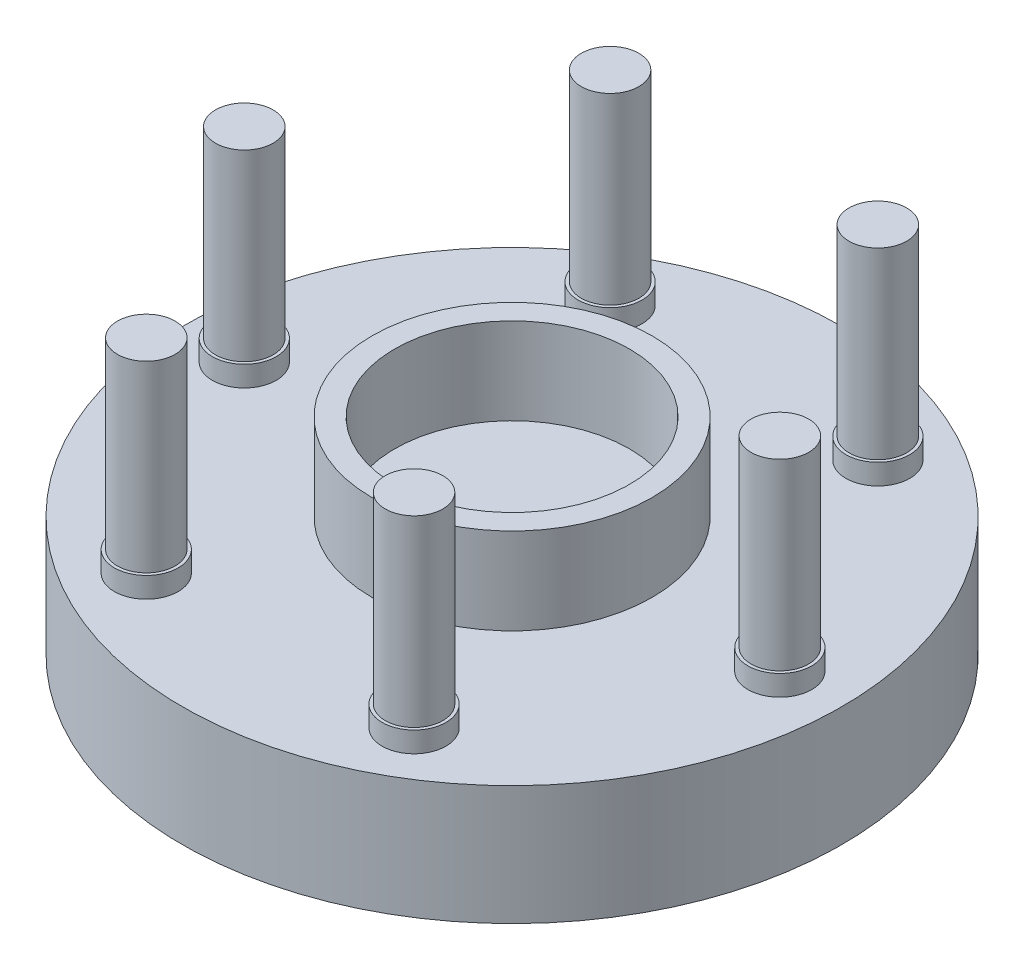
ISO-10303-21;
HEADER;
FILE_DESCRIPTION(('STEP AP214'),'2;1');
FILE_NAME('part.step','',(''),(''),'','','');
FILE_SCHEMA(('AUTOMOTIVE_DESIGN { 1 0 10303 214 1 1 1 1 }'));
ENDSEC;
DATA;
#1=APPLICATION_CONTEXT('core data for automotive mechanical design processes');
#2=APPLICATION_PROTOCOL_DEFINITION('international standard','automotive_design',2000,#1);
#3=PRODUCT_CONTEXT('',#1,'mechanical');
#4=PRODUCT('Part','Part','',(#3));
#5=PRODUCT_RELATED_PRODUCT_CATEGORY('part','',(#4));
#6=PRODUCT_DEFINITION_FORMATION('','',#4);
#7=PRODUCT_DEFINITION_CONTEXT('part definition',#1,'design');
#8=PRODUCT_DEFINITION('design','',#6,#7);
#9=PRODUCT_DEFINITION_SHAPE('','',#8);
#10=(LENGTH_UNIT() NAMED_UNIT(*) SI_UNIT(.MILLI.,.METRE.));
#11=(NAMED_UNIT(*) PLANE_ANGLE_UNIT() SI_UNIT($,.RADIAN.));
#12=(NAMED_UNIT(*) SI_UNIT($,.STERADIAN.) SOLID_ANGLE_UNIT());
#13=UNCERTAINTY_MEASURE_WITH_UNIT(LENGTH_MEASURE(1.E-05),#10,'distance_accuracy_value','');
#14=(GEOMETRIC_REPRESENTATION_CONTEXT(3) GLOBAL_UNCERTAINTY_ASSIGNED_CONTEXT((#13)) GLOBAL_UNIT_ASSIGNED_CONTEXT((#10,
#11,#12)) REPRESENTATION_CONTEXT('',''));
#15=CARTESIAN_POINT('',(0.,0.,0.));
#16=DIRECTION('',(0.,0.,1.));
#17=DIRECTION('',(1.,0.,0.));
#18=AXIS2_PLACEMENT_3D('',#15,#16,#17);
#19=CARTESIAN_POINT('',(0.,29.,0.));
#20=DIRECTION('',(0.,-1.,0.));
#21=DIRECTION('',(0.,0.,-1.));
#22=AXIS2_PLACEMENT_3D('',#19,#20,#21);
#23=CYLINDRICAL_SURFACE('',#22,80.);
#24=CARTESIAN_POINT('',(0.,29.,0.));
#25=DIRECTION('',(0.,1.,0.));
#26=DIRECTION('',(0.,0.,1.));
#27=AXIS2_PLACEMENT_3D('',#24,#25,#26);
#28=CIRCLE('',#27,80.);
#29=CARTESIAN_POINT('',(0.,29.,-80.));
#30=VERTEX_POINT('',#29);
#31=EDGE_CURVE('E149',#30,#30,#28,.T.);
#32=CARTESIAN_POINT('',(0.,0.,0.));
#33=DIRECTION('',(0.,1.,0.));
#34=DIRECTION('',(0.,0.,1.));
#35=AXIS2_PLACEMENT_3D('',#32,#33,#34);
#36=CIRCLE('',#35,80.);
#37=CARTESIAN_POINT('',(0.,0.,-80.));
#38=VERTEX_POINT('',#37);
#39=EDGE_CURVE('E145',#38,#38,#36,.T.);
#40=CARTESIAN_POINT('',(0.,29.,-80.));
#41=CARTESIAN_POINT('',(0.,28.6979166666667,-80.));
#42=CARTESIAN_POINT('',(0.,28.3958333333333,-80.));
#43=CARTESIAN_POINT('',(0.,27.7916666666667,-80.));
#44=CARTESIAN_POINT('',(0.,27.4895833333333,-80.));
#45=CARTESIAN_POINT('',(0.,26.8854166666667,-80.));
#46=CARTESIAN_POINT('',(0.,26.5833333333333,-80.));
#47=CARTESIAN_POINT('',(0.,25.9791666666667,-80.));
#48=CARTESIAN_POINT('',(0.,25.6770833333333,-80.));
#49=CARTESIAN_POINT('',(0.,25.0729166666667,-80.));
#50=CARTESIAN_POINT('',(0.,24.7708333333333,-80.));
#51=CARTESIAN_POINT('',(0.,24.1666666666667,-80.));
#52=CARTESIAN_POINT('',(0.,23.8645833333333,-80.));
#53=CARTESIAN_POINT('',(0.,23.2604166666667,-80.));
#54=CARTESIAN_POINT('',(0.,22.9583333333333,-80.));
#55=CARTESIAN_POINT('',(0.,22.3541666666667,-80.));
#56=CARTESIAN_POINT('',(0.,22.0520833333333,-80.));
#57=CARTESIAN_POINT('',(0.,21.4479166666667,-80.));
#58=CARTESIAN_POINT('',(0.,21.1458333333333,-80.));
#59=CARTESIAN_POINT('',(0.,20.5416666666667,-80.));
#60=CARTESIAN_POINT('',(0.,20.2395833333333,-80.));
#61=CARTESIAN_POINT('',(0.,19.6354166666667,-80.));
#62=CARTESIAN_POINT('',(0.,19.3333333333333,-80.));
#63=CARTESIAN_POINT('',(0.,18.7291666666667,-80.));
#64=CARTESIAN_POINT('',(0.,18.4270833333333,-80.));
#65=CARTESIAN_POINT('',(0.,17.8229166666667,-80.));
#66=CARTESIAN_POINT('',(0.,17.5208333333333,-80.));
#67=CARTESIAN_POINT('',(0.,16.9166666666667,-80.));
#68=CARTESIAN_POINT('',(0.,16.6145833333333,-80.));
#69=CARTESIAN_POINT('',(0.,16.0104166666667,-80.));
#70=CARTESIAN_POINT('',(0.,15.7083333333333,-80.));
#71=CARTESIAN_POINT('',(0.,15.1041666666667,-80.));
#72=CARTESIAN_POINT('',(0.,14.8020833333333,-80.));
#73=CARTESIAN_POINT('',(0.,14.1979166666667,-80.));
#74=CARTESIAN_POINT('',(0.,13.8958333333333,-80.));
#75=CARTESIAN_POINT('',(0.,13.2916666666667,-80.));
#76=CARTESIAN_POINT('',(0.,12.9895833333333,-80.));
#77=CARTESIAN_POINT('',(0.,12.3854166666667,-80.));
#78=CARTESIAN_POINT('',(0.,12.0833333333333,-80.));
#79=CARTESIAN_POINT('',(0.,11.4791666666667,-80.));
#80=CARTESIAN_POINT('',(0.,11.1770833333333,-80.));
#81=CARTESIAN_POINT('',(0.,10.5729166666667,-80.));
#82=CARTESIAN_POINT('',(0.,10.2708333333333,-80.));
#83=CARTESIAN_POINT('',(0.,9.66666666666667,-80.));
#84=CARTESIAN_POINT('',(0.,9.36458333333333,-80.));
#85=CARTESIAN_POINT('',(0.,8.76041666666667,-80.));
#86=CARTESIAN_POINT('',(0.,8.45833333333333,-80.));
#87=CARTESIAN_POINT('',(0.,7.85416666666667,-80.));
#88=CARTESIAN_POINT('',(0.,7.55208333333333,-80.));
#89=CARTESIAN_POINT('',(0.,6.94791666666667,-80.));
#90=CARTESIAN_POINT('',(0.,6.64583333333333,-80.));
#91=CARTESIAN_POINT('',(0.,6.04166666666667,-80.));
#92=CARTESIAN_POINT('',(0.,5.73958333333333,-80.));
#93=CARTESIAN_POINT('',(0.,5.13541666666667,-80.));
#94=CARTESIAN_POINT('',(0.,4.83333333333333,-80.));
#95=CARTESIAN_POINT('',(0.,4.22916666666667,-80.));
#96=CARTESIAN_POINT('',(0.,3.92708333333333,-80.));
#97=CARTESIAN_POINT('',(0.,3.32291666666667,-80.));
#98=CARTESIAN_POINT('',(0.,3.02083333333333,-80.));
#99=CARTESIAN_POINT('',(0.,2.41666666666667,-80.));
#100=CARTESIAN_POINT('',(0.,2.11458333333333,-80.));
#101=CARTESIAN_POINT('',(0.,1.51041666666667,-80.));
#102=CARTESIAN_POINT('',(0.,1.20833333333333,-80.));
#103=CARTESIAN_POINT('',(0.,0.604166666666667,-80.));
#104=CARTESIAN_POINT('',(0.,0.302083333333333,-80.));
#105=CARTESIAN_POINT('',(0.,0.,-80.));
#106=B_SPLINE_CURVE_WITH_KNOTS('',3,(#40,#41,#42,#43,#44,#45,#46,#47,#48,#49,#50,#51,#52,#53,
#54,#55,#56,#57,#58,#59,#60,#61,#62,#63,#64,#65,#66,#67,#68,#69,#70,#71,#72,#73,#74,#75,#76,#77,
#78,#79,#80,#81,#82,#83,#84,#85,#86,#87,#88,#89,#90,#91,#92,#93,#94,#95,#96,#97,#98,#99,#100,
#101,#102,#103,#104,#105),.UNSPECIFIED.,.F.,.F.,(4,2,2,2,2,2,2,2,2,2,2,2,2,2,2,2,2,2,2,2,2,2,2,
2,2,2,2,2,2,2,2,2,4),(0.,0.906249999999997,1.8125,2.71875,3.625,4.53125,5.4375,6.34375,7.25,
8.15625,9.0625,9.96875,10.875,11.78125,12.6875,13.59375,14.5,15.40625,16.3125,17.21875,18.125,
19.03125,19.9375,20.84375,21.75,22.65625,23.5625,24.46875,25.375,26.28125,27.1875,28.09375,29.),.UNSPECIFIED.);
#107=EDGE_CURVE('BSEAM43',#30,#38,#106,.T.);
#108=ORIENTED_EDGE('',*,*,#31,.F.);
#109=ORIENTED_EDGE('',*,*,#39,.T.);
#110=ORIENTED_EDGE('',*,*,#107,.T.);
#111=ORIENTED_EDGE('',*,*,#107,.F.);
#112=EDGE_LOOP('',(#108,#110,#109,#111));
#113=FACE_BOUND('',#112,.T.);
#114=ADVANCED_FACE('F43',(#113),#23,.T.);
#115=CARTESIAN_POINT('',(0.,29.,0.));
#116=DIRECTION('',(0.,1.,0.));
#117=DIRECTION('',(0.,0.,1.));
#118=AXIS2_PLACEMENT_3D('',#115,#116,#117);
#119=PLANE('',#118);
#120=CARTESIAN_POINT('',(65.,29.,0.));
#121=DIRECTION('',(0.,1.,0.));
#122=DIRECTION('',(0.,0.,1.));
#123=AXIS2_PLACEMENT_3D('',#120,#121,#122);
#124=CIRCLE('',#123,7.75);
#125=CARTESIAN_POINT('',(65.,29.,7.75));
#126=VERTEX_POINT('',#125);
#127=EDGE_CURVE('E93',#126,#126,#124,.T.);
#128=ORIENTED_EDGE('',*,*,#127,.F.);
#129=EDGE_LOOP('',(#128));
#130=FACE_BOUND('',#129,.T.);
#131=CARTESIAN_POINT('',(32.5000000000007,29.,-56.2916512459881));
#132=DIRECTION('',(0.,1.,0.));
#133=DIRECTION('',(0.,0.,1.));
#134=AXIS2_PLACEMENT_3D('',#131,#132,#133);
#135=CIRCLE('',#134,7.74999999999999);
#136=CARTESIAN_POINT('',(32.5000000000007,29.,-48.5416512459882));
#137=VERTEX_POINT('',#136);
#138=EDGE_CURVE('E98',#137,#137,#135,.T.);
#139=ORIENTED_EDGE('',*,*,#138,.F.);
#140=EDGE_LOOP('',(#139));
#141=FACE_BOUND('',#140,.T.);
#142=CARTESIAN_POINT('',(-32.4999999999995,29.,-56.2916512459888));
#143=DIRECTION('',(0.,1.,0.));
#144=DIRECTION('',(0.,0.,1.));
#145=AXIS2_PLACEMENT_3D('',#142,#143,#144);
#146=CIRCLE('',#145,7.75);
#147=CARTESIAN_POINT('',(-32.4999999999995,29.,-48.5416512459888));
#148=VERTEX_POINT('',#147);
#149=EDGE_CURVE('E130',#148,#148,#146,.T.);
#150=ORIENTED_EDGE('',*,*,#149,.F.);
#151=EDGE_LOOP('',(#150));
#152=FACE_BOUND('',#151,.T.);
#153=CARTESIAN_POINT('',(-65.,29.,-4.53892574049607E-13));
#154=DIRECTION('',(0.,1.,0.));
#155=DIRECTION('',(0.,0.,1.));
#156=AXIS2_PLACEMENT_3D('',#153,#154,#155);
#157=CIRCLE('',#156,7.75);
#158=CARTESIAN_POINT('',(-65.,29.,7.74999999999954));
#159=VERTEX_POINT('',#158);
#160=EDGE_CURVE('E122',#159,#159,#157,.T.);
#161=ORIENTED_EDGE('',*,*,#160,.F.);
#162=EDGE_LOOP('',(#161));
#163=FACE_BOUND('',#162,.T.);
#164=CARTESIAN_POINT('',(-32.5000000000003,29.,56.2916512459884));
#165=DIRECTION('',(0.,1.,0.));
#166=DIRECTION('',(0.,0.,1.));
#167=AXIS2_PLACEMENT_3D('',#164,#165,#166);
#168=CIRCLE('',#167,7.75);
#169=CARTESIAN_POINT('',(-32.5000000000003,29.,64.0416512459884));
#170=VERTEX_POINT('',#169);
#171=EDGE_CURVE('E114',#170,#170,#168,.T.);
#172=ORIENTED_EDGE('',*,*,#171,.F.);
#173=EDGE_LOOP('',(#172));
#174=FACE_BOUND('',#173,.T.);
#175=CARTESIAN_POINT('',(32.4999999999999,29.,56.2916512459886));
#176=DIRECTION('',(0.,1.,0.));
#177=DIRECTION('',(0.,0.,1.));
#178=AXIS2_PLACEMENT_3D('',#175,#176,#177);
#179=CIRCLE('',#178,7.75);
#180=CARTESIAN_POINT('',(32.4999999999999,29.,64.0416512459886));
#181=VERTEX_POINT('',#180);
#182=EDGE_CURVE('E97',#181,#181,#179,.T.);
#183=ORIENTED_EDGE('',*,*,#182,.F.);
#184=EDGE_LOOP('',(#183));
#185=FACE_BOUND('',#184,.T.);
#186=CARTESIAN_POINT('',(0.,29.,0.));
#187=DIRECTION('',(0.,1.,0.));
#188=DIRECTION('',(0.,0.,1.));
#189=AXIS2_PLACEMENT_3D('',#186,#187,#188);
#190=CIRCLE('',#189,34.);
#191=CARTESIAN_POINT('',(0.,29.,-34.));
#192=VERTEX_POINT('',#191);
#193=EDGE_CURVE('E140',#192,#192,#190,.T.);
#194=ORIENTED_EDGE('',*,*,#193,.F.);
#195=EDGE_LOOP('',(#194));
#196=FACE_BOUND('',#195,.T.);
#197=ORIENTED_EDGE('',*,*,#31,.T.);
#198=EDGE_LOOP('',(#197));
#199=FACE_BOUND('',#198,.T.);
#200=ADVANCED_FACE('F160',(#130,#141,#152,#163,#174,#185,#196,#199),#119,.T.);
#201=CARTESIAN_POINT('',(0.,0.,0.));
#202=DIRECTION('',(0.,1.,0.));
#203=DIRECTION('',(0.,0.,1.));
#204=AXIS2_PLACEMENT_3D('',#201,#202,#203);
#205=PLANE('',#204);
#206=ORIENTED_EDGE('',*,*,#39,.F.);
#207=EDGE_LOOP('',(#206));
#208=FACE_BOUND('',#207,.T.);
#209=ADVANCED_FACE('F157',(#208),#205,.F.);
#210=CARTESIAN_POINT('',(0.,50.,0.));
#211=DIRECTION('',(0.,1.,0.));
#212=DIRECTION('',(0.,0.,1.));
#213=AXIS2_PLACEMENT_3D('',#210,#211,#212);
#214=PLANE('',#213);
#215=CARTESIAN_POINT('',(0.,50.,0.));
#216=DIRECTION('',(0.,1.,0.));
#217=DIRECTION('',(0.,0.,1.));
#218=AXIS2_PLACEMENT_3D('',#215,#216,#217);
#219=CIRCLE('',#218,34.);
#220=CARTESIAN_POINT('',(0.,50.,-34.));
#221=VERTEX_POINT('',#220);
#222=EDGE_CURVE('E141',#221,#221,#219,.T.);
#223=ORIENTED_EDGE('',*,*,#222,.T.);
#224=EDGE_LOOP('',(#223));
#225=FACE_BOUND('',#224,.T.);
#226=CARTESIAN_POINT('',(0.,50.,0.));
#227=DIRECTION('',(0.,1.,0.));
#228=DIRECTION('',(0.,0.,1.));
#229=AXIS2_PLACEMENT_3D('',#226,#227,#228);
#230=CIRCLE('',#229,28.5);
#231=CARTESIAN_POINT('',(0.,50.,-28.5));
#232=VERTEX_POINT('',#231);
#233=EDGE_CURVE('E92',#232,#232,#230,.T.);
#234=ORIENTED_EDGE('',*,*,#233,.F.);
#235=EDGE_LOOP('',(#234));
#236=FACE_BOUND('',#235,.T.);
#237=ADVANCED_FACE('F159',(#225,#236),#214,.T.);
#238=CARTESIAN_POINT('',(0.,50.,0.));
#239=DIRECTION('',(0.,-1.,0.));
#240=DIRECTION('',(0.,0.,-1.));
#241=AXIS2_PLACEMENT_3D('',#238,#239,#240);
#242=CYLINDRICAL_SURFACE('',#241,34.);
#243=CARTESIAN_POINT('',(0.,50.,-34.));
#244=CARTESIAN_POINT('',(0.,49.78125,-34.));
#245=CARTESIAN_POINT('',(0.,49.5625,-34.));
#246=CARTESIAN_POINT('',(0.,49.125,-34.));
#247=CARTESIAN_POINT('',(0.,48.90625,-34.));
#248=CARTESIAN_POINT('',(0.,48.46875,-34.));
#249=CARTESIAN_POINT('',(0.,48.25,-34.));
#250=CARTESIAN_POINT('',(0.,47.8125,-34.));
#251=CARTESIAN_POINT('',(0.,47.59375,-34.));
#252=CARTESIAN_POINT('',(0.,47.15625,-34.));
#253=CARTESIAN_POINT('',(0.,46.9375,-34.));
#254=CARTESIAN_POINT('',(0.,46.5,-34.));
#255=CARTESIAN_POINT('',(0.,46.28125,-34.));
#256=CARTESIAN_POINT('',(0.,45.84375,-34.));
#257=CARTESIAN_POINT('',(0.,45.625,-34.));
#258=CARTESIAN_POINT('',(0.,45.1875,-34.));
#259=CARTESIAN_POINT('',(0.,44.96875,-34.));
#260=CARTESIAN_POINT('',(0.,44.53125,-34.));
#261=CARTESIAN_POINT('',(0.,44.3125,-34.));
#262=CARTESIAN_POINT('',(0.,43.875,-34.));
#263=CARTESIAN_POINT('',(0.,43.65625,-34.));
#264=CARTESIAN_POINT('',(0.,43.21875,-34.));
#265=CARTESIAN_POINT('',(0.,43.,-34.));
#266=CARTESIAN_POINT('',(0.,42.5625,-34.));
#267=CARTESIAN_POINT('',(0.,42.34375,-34.));
#268=CARTESIAN_POINT('',(0.,41.90625,-34.));
#269=CARTESIAN_POINT('',(0.,41.6875,-34.));
#270=CARTESIAN_POINT('',(0.,41.25,-34.));
#271=CARTESIAN_POINT('',(0.,41.03125,-34.));
#272=CARTESIAN_POINT('',(0.,40.59375,-34.));
#273=CARTESIAN_POINT('',(0.,40.375,-34.));
#274=CARTESIAN_POINT('',(0.,39.9375,-34.));
#275=CARTESIAN_POINT('',(0.,39.71875,-34.));
#276=CARTESIAN_POINT('',(0.,39.28125,-34.));
#277=CARTESIAN_POINT('',(0.,39.0625,-34.));
#278=CARTESIAN_POINT('',(0.,38.625,-34.));
#279=CARTESIAN_POINT('',(0.,38.40625,-34.));
#280=CARTESIAN_POINT('',(0.,37.96875,-34.));
#281=CARTESIAN_POINT('',(0.,37.75,-34.));
#282=CARTESIAN_POINT('',(0.,37.3125,-34.));
#283=CARTESIAN_POINT('',(0.,37.09375,-34.));
#284=CARTESIAN_POINT('',(0.,36.65625,-34.));
#285=CARTESIAN_POINT('',(0.,36.4375,-34.));
#286=CARTESIAN_POINT('',(0.,36.,-34.));
#287=CARTESIAN_POINT('',(0.,35.78125,-34.));
#288=CARTESIAN_POINT('',(0.,35.34375,-34.));
#289=CARTESIAN_POINT('',(0.,35.125,-34.));
#290=CARTESIAN_POINT('',(0.,34.6875,-34.));
#291=CARTESIAN_POINT('',(0.,34.46875,-34.));
#292=CARTESIAN_POINT('',(0.,34.03125,-34.));
#293=CARTESIAN_POINT('',(0.,33.8125,-34.));
#294=CARTESIAN_POINT('',(0.,33.375,-34.));
#295=CARTESIAN_POINT('',(0.,33.15625,-34.));
#296=CARTESIAN_POINT('',(0.,32.71875,-34.));
#297=CARTESIAN_POINT('',(0.,32.5,-34.));
#298=CARTESIAN_POINT('',(0.,32.0625,-34.));
#299=CARTESIAN_POINT('',(0.,31.84375,-34.));
#300=CARTESIAN_POINT('',(0.,31.40625,-34.));
#301=CARTESIAN_POINT('',(0.,31.1875,-34.));
#302=CARTESIAN_POINT('',(0.,30.75,-34.));
#303=CARTESIAN_POINT('',(0.,30.53125,-34.));
#304=CARTESIAN_POINT('',(0.,30.09375,-34.));
#305=CARTESIAN_POINT('',(0.,29.875,-34.));
#306=CARTESIAN_POINT('',(0.,29.4375,-34.));
#307=CARTESIAN_POINT('',(0.,29.21875,-34.));
#308=CARTESIAN_POINT('',(0.,29.,-34.));
#309=B_SPLINE_CURVE_WITH_KNOTS('',3,(#243,#244,#245,#246,#247,#248,#249,#250,#251,#252,#253,
#254,#255,#256,#257,#258,#259,#260,#261,#262,#263,#264,#265,#266,#267,#268,#269,#270,#271,#272,
#273,#274,#275,#276,#277,#278,#279,#280,#281,#282,#283,#284,#285,#286,#287,#288,#289,#290,#291,
#292,#293,#294,#295,#296,#297,#298,#299,#300,#301,#302,#303,#304,#305,#306,#307,#308),
.UNSPECIFIED.,.F.,.F.,(4,2,2,2,2,2,2,2,2,2,2,2,2,2,2,2,2,2,2,2,2,2,2,2,2,2,2,2,2,2,2,2,4),(0.,
0.656249999999997,1.31249999999999,1.96875,2.625,3.28125,3.9375,4.59374999999999,5.25,
5.90624999999999,6.5625,7.21875,7.87499999999999,8.53125,9.18749999999999,9.84374999999999,10.5,
11.15625,11.8125,12.46875,13.125,13.78125,14.4375,15.09375,15.75,16.40625,17.0625,17.71875,
18.375,19.03125,19.6875,20.34375,21.),.UNSPECIFIED.);
#310=EDGE_CURVE('BSEAM165',#221,#192,#309,.T.);
#311=ORIENTED_EDGE('',*,*,#222,.F.);
#312=ORIENTED_EDGE('',*,*,#193,.T.);
#313=ORIENTED_EDGE('',*,*,#310,.T.);
#314=ORIENTED_EDGE('',*,*,#310,.F.);
#315=EDGE_LOOP('',(#311,#313,#312,#314));
#316=FACE_BOUND('',#315,.T.);
#317=ADVANCED_FACE('F165',(#316),#242,.T.);
#318=CARTESIAN_POINT('',(0.,50.,0.));
#319=DIRECTION('',(0.,-1.,0.));
#320=DIRECTION('',(0.,0.,-1.));
#321=AXIS2_PLACEMENT_3D('',#318,#319,#320);
#322=CYLINDRICAL_SURFACE('',#321,28.5);
#323=CARTESIAN_POINT('',(0.,29.,0.));
#324=DIRECTION('',(0.,1.,0.));
#325=DIRECTION('',(0.,0.,1.));
#326=AXIS2_PLACEMENT_3D('',#323,#324,#325);
#327=CIRCLE('',#326,28.5);
#328=CARTESIAN_POINT('',(0.,29.,-28.5));
#329=VERTEX_POINT('',#328);
#330=EDGE_CURVE('E46',#329,#329,#327,.F.);
#331=CARTESIAN_POINT('',(0.,50.,-28.5));
#332=CARTESIAN_POINT('',(0.,49.78125,-28.5));
#333=CARTESIAN_POINT('',(0.,49.5625,-28.5));
#334=CARTESIAN_POINT('',(0.,49.125,-28.5));
#335=CARTESIAN_POINT('',(0.,48.90625,-28.5));
#336=CARTESIAN_POINT('',(0.,48.46875,-28.5));
#337=CARTESIAN_POINT('',(0.,48.25,-28.5));
#338=CARTESIAN_POINT('',(0.,47.8125,-28.5));
#339=CARTESIAN_POINT('',(0.,47.59375,-28.5));
#340=CARTESIAN_POINT('',(0.,47.15625,-28.5));
#341=CARTESIAN_POINT('',(0.,46.9375,-28.5));
#342=CARTESIAN_POINT('',(0.,46.5,-28.5));
#343=CARTESIAN_POINT('',(0.,46.28125,-28.5));
#344=CARTESIAN_POINT('',(0.,45.84375,-28.5));
#345=CARTESIAN_POINT('',(0.,45.625,-28.5));
#346=CARTESIAN_POINT('',(0.,45.1875,-28.5));
#347=CARTESIAN_POINT('',(0.,44.96875,-28.5));
#348=CARTESIAN_POINT('',(0.,44.53125,-28.5));
#349=CARTESIAN_POINT('',(0.,44.3125,-28.5));
#350=CARTESIAN_POINT('',(0.,43.875,-28.5));
#351=CARTESIAN_POINT('',(0.,43.65625,-28.5));
#352=CARTESIAN_POINT('',(0.,43.21875,-28.5));
#353=CARTESIAN_POINT('',(0.,43.,-28.5));
#354=CARTESIAN_POINT('',(0.,42.5625,-28.5));
#355=CARTESIAN_POINT('',(0.,42.34375,-28.5));
#356=CARTESIAN_POINT('',(0.,41.90625,-28.5));
#357=CARTESIAN_POINT('',(0.,41.6875,-28.5));
#358=CARTESIAN_POINT('',(0.,41.25,-28.5));
#359=CARTESIAN_POINT('',(0.,41.03125,-28.5));
#360=CARTESIAN_POINT('',(0.,40.59375,-28.5));
#361=CARTESIAN_POINT('',(0.,40.375,-28.5));
#362=CARTESIAN_POINT('',(0.,39.9375,-28.5));
#363=CARTESIAN_POINT('',(0.,39.71875,-28.5));
#364=CARTESIAN_POINT('',(0.,39.28125,-28.5));
#365=CARTESIAN_POINT('',(0.,39.0625,-28.5));
#366=CARTESIAN_POINT('',(0.,38.625,-28.5));
#367=CARTESIAN_POINT('',(0.,38.40625,-28.5));
#368=CARTESIAN_POINT('',(0.,37.96875,-28.5));
#369=CARTESIAN_POINT('',(0.,37.75,-28.5));
#370=CARTESIAN_POINT('',(0.,37.3125,-28.5));
#371=CARTESIAN_POINT('',(0.,37.09375,-28.5));
#372=CARTESIAN_POINT('',(0.,36.65625,-28.5));
#373=CARTESIAN_POINT('',(0.,36.4375,-28.5));
#374=CARTESIAN_POINT('',(0.,36.,-28.5));
#375=CARTESIAN_POINT('',(0.,35.78125,-28.5));
#376=CARTESIAN_POINT('',(0.,35.34375,-28.5));
#377=CARTESIAN_POINT('',(0.,35.125,-28.5));
#378=CARTESIAN_POINT('',(0.,34.6875,-28.5));
#379=CARTESIAN_POINT('',(0.,34.46875,-28.5));
#380=CARTESIAN_POINT('',(0.,34.03125,-28.5));
#381=CARTESIAN_POINT('',(0.,33.8125,-28.5));
#382=CARTESIAN_POINT('',(0.,33.375,-28.5));
#383=CARTESIAN_POINT('',(0.,33.15625,-28.5));
#384=CARTESIAN_POINT('',(0.,32.71875,-28.5));
#385=CARTESIAN_POINT('',(0.,32.5,-28.5));
#386=CARTESIAN_POINT('',(0.,32.0625,-28.5));
#387=CARTESIAN_POINT('',(0.,31.84375,-28.5));
#388=CARTESIAN_POINT('',(0.,31.40625,-28.5));
#389=CARTESIAN_POINT('',(0.,31.1875,-28.5));
#390=CARTESIAN_POINT('',(0.,30.75,-28.5));
#391=CARTESIAN_POINT('',(0.,30.53125,-28.5));
#392=CARTESIAN_POINT('',(0.,30.09375,-28.5));
#393=CARTESIAN_POINT('',(0.,29.875,-28.5));
#394=CARTESIAN_POINT('',(0.,29.4375,-28.5));
#395=CARTESIAN_POINT('',(0.,29.21875,-28.5));
#396=CARTESIAN_POINT('',(0.,29.,-28.5));
#397=B_SPLINE_CURVE_WITH_KNOTS('',3,(#331,#332,#333,#334,#335,#336,#337,#338,#339,#340,#341,
#342,#343,#344,#345,#346,#347,#348,#349,#350,#351,#352,#353,#354,#355,#356,#357,#358,#359,#360,
#361,#362,#363,#364,#365,#366,#367,#368,#369,#370,#371,#372,#373,#374,#375,#376,#377,#378,#379,
#380,#381,#382,#383,#384,#385,#386,#387,#388,#389,#390,#391,#392,#393,#394,#395,#396),
.UNSPECIFIED.,.F.,.F.,(4,2,2,2,2,2,2,2,2,2,2,2,2,2,2,2,2,2,2,2,2,2,2,2,2,2,2,2,2,2,2,2,4),(0.,
0.656249999999997,1.31249999999999,1.96875,2.625,3.28125,3.9375,4.59374999999999,5.25,
5.90624999999999,6.5625,7.21875,7.87499999999999,8.53125,9.18749999999999,9.84374999999999,10.5,
11.15625,11.8125,12.46875,13.125,13.78125,14.4375,15.09375,15.75,16.40625,17.0625,17.71875,
18.375,19.03125,19.6875,20.34375,21.),.UNSPECIFIED.);
#398=EDGE_CURVE('BSEAM199',#232,#329,#397,.T.);
#399=ORIENTED_EDGE('',*,*,#233,.T.);
#400=ORIENTED_EDGE('',*,*,#330,.T.);
#401=ORIENTED_EDGE('',*,*,#398,.T.);
#402=ORIENTED_EDGE('',*,*,#398,.F.);
#403=EDGE_LOOP('',(#399,#401,#400,#402));
#404=FACE_BOUND('',#403,.T.);
#405=ADVANCED_FACE('F199',(#404),#322,.F.);
#406=ORIENTED_EDGE('',*,*,#330,.F.);
#407=EDGE_LOOP('',(#406));
#408=FACE_BOUND('',#407,.T.);
#409=ADVANCED_FACE('F171',(#408),#119,.T.);
#410=CARTESIAN_POINT('',(32.4999999999999,34.,56.2916512459886));
#411=DIRECTION('',(0.,-1.,0.));
#412=DIRECTION('',(0.,0.,-1.));
#413=AXIS2_PLACEMENT_3D('',#410,#411,#412);
#414=CYLINDRICAL_SURFACE('',#413,7.75);
#415=CARTESIAN_POINT('',(32.4999999999999,34.,56.2916512459886));
#416=DIRECTION('',(0.,1.,0.));
#417=DIRECTION('',(0.,0.,1.));
#418=AXIS2_PLACEMENT_3D('',#415,#416,#417);
#419=CIRCLE('',#418,7.75);
#420=CARTESIAN_POINT('',(32.4999999999999,34.,64.0416512459886));
#421=VERTEX_POINT('',#420);
#422=EDGE_CURVE('E110',#421,#421,#419,.T.);
#423=ORIENTED_EDGE('',*,*,#422,.F.);
#424=EDGE_LOOP('',(#423));
#425=FACE_BOUND('',#424,.T.);
#426=ORIENTED_EDGE('',*,*,#182,.T.);
#427=EDGE_LOOP('',(#426));
#428=FACE_BOUND('',#427,.T.);
#429=ADVANCED_FACE('F198',(#425,#428),#414,.T.);
#430=CARTESIAN_POINT('',(32.4999999999999,34.,56.2916512459886));
#431=DIRECTION('',(0.,1.,0.));
#432=DIRECTION('',(0.,0.,1.));
#433=AXIS2_PLACEMENT_3D('',#430,#431,#432);
#434=PLANE('',#433);
#435=CARTESIAN_POINT('',(32.4999999999999,34.,56.2916512459886));
#436=DIRECTION('',(0.,1.,0.));
#437=DIRECTION('',(0.,0.,1.));
#438=AXIS2_PLACEMENT_3D('',#435,#436,#437);
#439=CIRCLE('',#438,7.);
#440=CARTESIAN_POINT('',(32.4999999999999,34.,63.2916512459886));
#441=VERTEX_POINT('',#440);
#442=EDGE_CURVE('E10',#441,#441,#439,.T.);
#443=ORIENTED_EDGE('',*,*,#442,.F.);
#444=EDGE_LOOP('',(#443));
#445=FACE_BOUND('',#444,.T.);
#446=ORIENTED_EDGE('',*,*,#422,.T.);
#447=EDGE_LOOP('',(#446));
#448=FACE_BOUND('',#447,.T.);
#449=ADVANCED_FACE('F230',(#445,#448),#434,.T.);
#450=CARTESIAN_POINT('',(-32.5000000000003,34.,56.2916512459884));
#451=DIRECTION('',(0.,-1.,0.));
#452=DIRECTION('',(0.,0.,-1.));
#453=AXIS2_PLACEMENT_3D('',#450,#451,#452);
#454=CYLINDRICAL_SURFACE('',#453,7.75);
#455=CARTESIAN_POINT('',(-32.5000000000003,34.,56.2916512459884));
#456=DIRECTION('',(0.,1.,0.));
#457=DIRECTION('',(0.,0.,1.));
#458=AXIS2_PLACEMENT_3D('',#455,#456,#457);
#459=CIRCLE('',#458,7.75);
#460=CARTESIAN_POINT('',(-32.5000000000003,34.,64.0416512459884));
#461=VERTEX_POINT('',#460);
#462=EDGE_CURVE('E118',#461,#461,#459,.T.);
#463=ORIENTED_EDGE('',*,*,#462,.F.);
#464=EDGE_LOOP('',(#463));
#465=FACE_BOUND('',#464,.T.);
#466=ORIENTED_EDGE('',*,*,#171,.T.);
#467=EDGE_LOOP('',(#466));
#468=FACE_BOUND('',#467,.T.);
#469=ADVANCED_FACE('F241',(#465,#468),#454,.T.);
#470=CARTESIAN_POINT('',(-32.5000000000003,34.,56.2916512459884));
#471=DIRECTION('',(0.,1.,0.));
#472=DIRECTION('',(0.,0.,1.));
#473=AXIS2_PLACEMENT_3D('',#470,#471,#472);
#474=PLANE('',#473);
#475=CARTESIAN_POINT('',(-32.5000000000003,34.,56.2916512459884));
#476=DIRECTION('',(0.,1.,0.));
#477=DIRECTION('',(0.,0.,1.));
#478=AXIS2_PLACEMENT_3D('',#475,#476,#477);
#479=CIRCLE('',#478,7.);
#480=CARTESIAN_POINT('',(-32.5000000000003,34.,63.2916512459884));
#481=VERTEX_POINT('',#480);
#482=EDGE_CURVE('E51',#481,#481,#479,.T.);
#483=ORIENTED_EDGE('',*,*,#482,.F.);
#484=EDGE_LOOP('',(#483));
#485=FACE_BOUND('',#484,.T.);
#486=ORIENTED_EDGE('',*,*,#462,.T.);
#487=EDGE_LOOP('',(#486));
#488=FACE_BOUND('',#487,.T.);
#489=ADVANCED_FACE('F252',(#485,#488),#474,.T.);
#490=CARTESIAN_POINT('',(-65.,34.,-4.53892574049607E-13));
#491=DIRECTION('',(0.,-1.,0.));
#492=DIRECTION('',(0.,0.,-1.));
#493=AXIS2_PLACEMENT_3D('',#490,#491,#492);
#494=CYLINDRICAL_SURFACE('',#493,7.75);
#495=CARTESIAN_POINT('',(-65.,34.,-4.53892574049607E-13));
#496=DIRECTION('',(0.,1.,0.));
#497=DIRECTION('',(0.,0.,1.));
#498=AXIS2_PLACEMENT_3D('',#495,#496,#497);
#499=CIRCLE('',#498,7.75);
#500=CARTESIAN_POINT('',(-65.,34.,7.74999999999954));
#501=VERTEX_POINT('',#500);
#502=EDGE_CURVE('E126',#501,#501,#499,.T.);
#503=ORIENTED_EDGE('',*,*,#502,.F.);
#504=EDGE_LOOP('',(#503));
#505=FACE_BOUND('',#504,.T.);
#506=ORIENTED_EDGE('',*,*,#160,.T.);
#507=EDGE_LOOP('',(#506));
#508=FACE_BOUND('',#507,.T.);
#509=ADVANCED_FACE('F262',(#505,#508),#494,.T.);
#510=CARTESIAN_POINT('',(-65.,34.,-4.53892574049607E-13));
#511=DIRECTION('',(0.,1.,0.));
#512=DIRECTION('',(0.,0.,1.));
#513=AXIS2_PLACEMENT_3D('',#510,#511,#512);
#514=PLANE('',#513);
#515=CARTESIAN_POINT('',(-65.,34.,-4.53892574049607E-13));
#516=DIRECTION('',(0.,1.,0.));
#517=DIRECTION('',(0.,0.,1.));
#518=AXIS2_PLACEMENT_3D('',#515,#516,#517);
#519=CIRCLE('',#518,7.);
#520=CARTESIAN_POINT('',(-65.,34.,6.99999999999955));
#521=VERTEX_POINT('',#520);
#522=EDGE_CURVE('E57',#521,#521,#519,.T.);
#523=ORIENTED_EDGE('',*,*,#522,.F.);
#524=EDGE_LOOP('',(#523));
#525=FACE_BOUND('',#524,.T.);
#526=ORIENTED_EDGE('',*,*,#502,.T.);
#527=EDGE_LOOP('',(#526));
#528=FACE_BOUND('',#527,.T.);
#529=ADVANCED_FACE('F272',(#525,#528),#514,.T.);
#530=CARTESIAN_POINT('',(-32.4999999999995,34.,-56.2916512459888));
#531=DIRECTION('',(0.,-1.,0.));
#532=DIRECTION('',(0.,0.,-1.));
#533=AXIS2_PLACEMENT_3D('',#530,#531,#532);
#534=CYLINDRICAL_SURFACE('',#533,7.75);
#535=CARTESIAN_POINT('',(-32.4999999999995,34.,-56.2916512459888));
#536=DIRECTION('',(0.,1.,0.));
#537=DIRECTION('',(0.,0.,1.));
#538=AXIS2_PLACEMENT_3D('',#535,#536,#537);
#539=CIRCLE('',#538,7.75);
#540=CARTESIAN_POINT('',(-32.4999999999995,34.,-48.5416512459888));
#541=VERTEX_POINT('',#540);
#542=EDGE_CURVE('E102',#541,#541,#539,.T.);
#543=ORIENTED_EDGE('',*,*,#542,.F.);
#544=EDGE_LOOP('',(#543));
#545=FACE_BOUND('',#544,.T.);
#546=ORIENTED_EDGE('',*,*,#149,.T.);
#547=EDGE_LOOP('',(#546));
#548=FACE_BOUND('',#547,.T.);
#549=ADVANCED_FACE('F282',(#545,#548),#534,.T.);
#550=CARTESIAN_POINT('',(-32.4999999999995,34.,-56.2916512459888));
#551=DIRECTION('',(0.,1.,0.));
#552=DIRECTION('',(0.,0.,1.));
#553=AXIS2_PLACEMENT_3D('',#550,#551,#552);
#554=PLANE('',#553);
#555=CARTESIAN_POINT('',(-32.4999999999995,34.,-56.2916512459888));
#556=DIRECTION('',(0.,1.,0.));
#557=DIRECTION('',(0.,0.,1.));
#558=AXIS2_PLACEMENT_3D('',#555,#556,#557);
#559=CIRCLE('',#558,7.);
#560=CARTESIAN_POINT('',(-32.4999999999995,34.,-49.2916512459888));
#561=VERTEX_POINT('',#560);
#562=EDGE_CURVE('E76',#561,#561,#559,.T.);
#563=ORIENTED_EDGE('',*,*,#562,.F.);
#564=EDGE_LOOP('',(#563));
#565=FACE_BOUND('',#564,.T.);
#566=ORIENTED_EDGE('',*,*,#542,.T.);
#567=EDGE_LOOP('',(#566));
#568=FACE_BOUND('',#567,.T.);
#569=ADVANCED_FACE('F292',(#565,#568),#554,.T.);
#570=CARTESIAN_POINT('',(32.5000000000007,34.,-56.2916512459881));
#571=DIRECTION('',(0.,-1.,0.));
#572=DIRECTION('',(0.,0.,-1.));
#573=AXIS2_PLACEMENT_3D('',#570,#571,#572);
#574=CYLINDRICAL_SURFACE('',#573,7.74999999999999);
#575=CARTESIAN_POINT('',(32.5000000000007,34.,-56.2916512459881));
#576=DIRECTION('',(0.,1.,0.));
#577=DIRECTION('',(0.,0.,1.));
#578=AXIS2_PLACEMENT_3D('',#575,#576,#577);
#579=CIRCLE('',#578,7.74999999999999);
#580=CARTESIAN_POINT('',(32.5000000000007,34.,-48.5416512459882));
#581=VERTEX_POINT('',#580);
#582=EDGE_CURVE('E103',#581,#581,#579,.T.);
#583=ORIENTED_EDGE('',*,*,#582,.F.);
#584=EDGE_LOOP('',(#583));
#585=FACE_BOUND('',#584,.T.);
#586=ORIENTED_EDGE('',*,*,#138,.T.);
#587=EDGE_LOOP('',(#586));
#588=FACE_BOUND('',#587,.T.);
#589=ADVANCED_FACE('F302',(#585,#588),#574,.T.);
#590=CARTESIAN_POINT('',(32.5000000000007,34.,-56.2916512459881));
#591=DIRECTION('',(0.,1.,0.));
#592=DIRECTION('',(0.,0.,1.));
#593=AXIS2_PLACEMENT_3D('',#590,#591,#592);
#594=PLANE('',#593);
#595=CARTESIAN_POINT('',(32.5000000000007,34.,-56.2916512459881));
#596=DIRECTION('',(0.,1.,0.));
#597=DIRECTION('',(0.,0.,1.));
#598=AXIS2_PLACEMENT_3D('',#595,#596,#597);
#599=CIRCLE('',#598,6.99999999999999);
#600=CARTESIAN_POINT('',(32.5000000000007,34.,-49.2916512459882));
#601=VERTEX_POINT('',#600);
#602=EDGE_CURVE('E84',#601,#601,#599,.T.);
#603=ORIENTED_EDGE('',*,*,#602,.F.);
#604=EDGE_LOOP('',(#603));
#605=FACE_BOUND('',#604,.T.);
#606=ORIENTED_EDGE('',*,*,#582,.T.);
#607=EDGE_LOOP('',(#606));
#608=FACE_BOUND('',#607,.T.);
#609=ADVANCED_FACE('F312',(#605,#608),#594,.T.);
#610=CARTESIAN_POINT('',(65.,34.,0.));
#611=DIRECTION('',(0.,-1.,0.));
#612=DIRECTION('',(0.,0.,-1.));
#613=AXIS2_PLACEMENT_3D('',#610,#611,#612);
#614=CYLINDRICAL_SURFACE('',#613,7.75);
#615=CARTESIAN_POINT('',(65.,34.,0.));
#616=DIRECTION('',(0.,1.,0.));
#617=DIRECTION('',(0.,0.,1.));
#618=AXIS2_PLACEMENT_3D('',#615,#616,#617);
#619=CIRCLE('',#618,7.75);
#620=CARTESIAN_POINT('',(65.,34.,7.75));
#621=VERTEX_POINT('',#620);
#622=EDGE_CURVE('E88',#621,#621,#619,.T.);
#623=ORIENTED_EDGE('',*,*,#622,.F.);
#624=EDGE_LOOP('',(#623));
#625=FACE_BOUND('',#624,.T.);
#626=ORIENTED_EDGE('',*,*,#127,.T.);
#627=EDGE_LOOP('',(#626));
#628=FACE_BOUND('',#627,.T.);
#629=ADVANCED_FACE('F321',(#625,#628),#614,.T.);
#630=CARTESIAN_POINT('',(65.,34.,0.));
#631=DIRECTION('',(0.,1.,0.));
#632=DIRECTION('',(0.,0.,1.));
#633=AXIS2_PLACEMENT_3D('',#630,#631,#632);
#634=PLANE('',#633);
#635=CARTESIAN_POINT('',(65.,34.,0.));
#636=DIRECTION('',(0.,1.,0.));
#637=DIRECTION('',(0.,0.,1.));
#638=AXIS2_PLACEMENT_3D('',#635,#636,#637);
#639=CIRCLE('',#638,7.);
#640=CARTESIAN_POINT('',(65.,34.,7.));
#641=VERTEX_POINT('',#640);
#642=EDGE_CURVE('E502',#641,#641,#639,.T.);
#643=ORIENTED_EDGE('',*,*,#642,.F.);
#644=EDGE_LOOP('',(#643));
#645=FACE_BOUND('',#644,.T.);
#646=ORIENTED_EDGE('',*,*,#622,.T.);
#647=EDGE_LOOP('',(#646));
#648=FACE_BOUND('',#647,.T.);
#649=ADVANCED_FACE('F331',(#645,#648),#634,.T.);
#650=CARTESIAN_POINT('',(65.,78.5,0.));
#651=DIRECTION('',(0.,-1.,0.));
#652=DIRECTION('',(0.,0.,-1.));
#653=AXIS2_PLACEMENT_3D('',#650,#651,#652);
#654=CYLINDRICAL_SURFACE('',#653,7.);
#655=CARTESIAN_POINT('',(65.,78.5,0.));
#656=DIRECTION('',(0.,1.,0.));
#657=DIRECTION('',(0.,0.,1.));
#658=AXIS2_PLACEMENT_3D('',#655,#656,#657);
#659=CIRCLE('',#658,7.);
#660=CARTESIAN_POINT('',(65.,78.5,7.));
#661=VERTEX_POINT('',#660);
#662=EDGE_CURVE('E66',#661,#661,#659,.T.);
#663=ORIENTED_EDGE('',*,*,#662,.F.);
#664=EDGE_LOOP('',(#663));
#665=FACE_BOUND('',#664,.T.);
#666=ORIENTED_EDGE('',*,*,#642,.T.);
#667=EDGE_LOOP('',(#666));
#668=FACE_BOUND('',#667,.T.);
#669=ADVANCED_FACE('F340',(#665,#668),#654,.T.);
#670=CARTESIAN_POINT('',(65.,78.5,0.));
#671=DIRECTION('',(0.,1.,0.));
#672=DIRECTION('',(0.,0.,1.));
#673=AXIS2_PLACEMENT_3D('',#670,#671,#672);
#674=PLANE('',#673);
#675=ORIENTED_EDGE('',*,*,#662,.T.);
#676=EDGE_LOOP('',(#675));
#677=FACE_BOUND('',#676,.T.);
#678=ADVANCED_FACE('F350',(#677),#674,.T.);
#679=CARTESIAN_POINT('',(32.5000000000007,78.5,-56.2916512459881));
#680=DIRECTION('',(0.,-1.,0.));
#681=DIRECTION('',(0.,0.,-1.));
#682=AXIS2_PLACEMENT_3D('',#679,#680,#681);
#683=CYLINDRICAL_SURFACE('',#682,6.99999999999999);
#684=CARTESIAN_POINT('',(32.5000000000007,78.5,-56.2916512459881));
#685=DIRECTION('',(0.,1.,0.));
#686=DIRECTION('',(0.,0.,1.));
#687=AXIS2_PLACEMENT_3D('',#684,#685,#686);
#688=CIRCLE('',#687,6.99999999999999);
#689=CARTESIAN_POINT('',(32.5000000000007,78.5,-49.2916512459882));
#690=VERTEX_POINT('',#689);
#691=EDGE_CURVE('E61',#690,#690,#688,.T.);
#692=ORIENTED_EDGE('',*,*,#691,.F.);
#693=EDGE_LOOP('',(#692));
#694=FACE_BOUND('',#693,.T.);
#695=ORIENTED_EDGE('',*,*,#602,.T.);
#696=EDGE_LOOP('',(#695));
#697=FACE_BOUND('',#696,.T.);
#698=ADVANCED_FACE('F360',(#694,#697),#683,.T.);
#699=CARTESIAN_POINT('',(32.5000000000007,78.5,-56.2916512459881));
#700=DIRECTION('',(0.,1.,0.));
#701=DIRECTION('',(0.,0.,1.));
#702=AXIS2_PLACEMENT_3D('',#699,#700,#701);
#703=PLANE('',#702);
#704=ORIENTED_EDGE('',*,*,#691,.T.);
#705=EDGE_LOOP('',(#704));
#706=FACE_BOUND('',#705,.T.);
#707=ADVANCED_FACE('F370',(#706),#703,.T.);
#708=CARTESIAN_POINT('',(-32.4999999999995,78.5,-56.2916512459888));
#709=DIRECTION('',(0.,-1.,0.));
#710=DIRECTION('',(0.,0.,-1.));
#711=AXIS2_PLACEMENT_3D('',#708,#709,#710);
#712=CYLINDRICAL_SURFACE('',#711,7.);
#713=CARTESIAN_POINT('',(-32.4999999999995,78.5,-56.2916512459888));
#714=DIRECTION('',(0.,1.,0.));
#715=DIRECTION('',(0.,0.,1.));
#716=AXIS2_PLACEMENT_3D('',#713,#714,#715);
#717=CIRCLE('',#716,7.);
#718=CARTESIAN_POINT('',(-32.4999999999995,78.5,-49.2916512459888));
#719=VERTEX_POINT('',#718);
#720=EDGE_CURVE('E80',#719,#719,#717,.T.);
#721=ORIENTED_EDGE('',*,*,#720,.F.);
#722=EDGE_LOOP('',(#721));
#723=FACE_BOUND('',#722,.T.);
#724=ORIENTED_EDGE('',*,*,#562,.T.);
#725=EDGE_LOOP('',(#724));
#726=FACE_BOUND('',#725,.T.);
#727=ADVANCED_FACE('F380',(#723,#726),#712,.T.);
#728=CARTESIAN_POINT('',(-32.4999999999995,78.5,-56.2916512459888));
#729=DIRECTION('',(0.,1.,0.));
#730=DIRECTION('',(0.,0.,1.));
#731=AXIS2_PLACEMENT_3D('',#728,#729,#730);
#732=PLANE('',#731);
#733=ORIENTED_EDGE('',*,*,#720,.T.);
#734=EDGE_LOOP('',(#733));
#735=FACE_BOUND('',#734,.T.);
#736=ADVANCED_FACE('F390',(#735),#732,.T.);
#737=CARTESIAN_POINT('',(-65.,78.5,-4.53892574049607E-13));
#738=DIRECTION('',(0.,-1.,0.));
#739=DIRECTION('',(0.,0.,-1.));
#740=AXIS2_PLACEMENT_3D('',#737,#738,#739);
#741=CYLINDRICAL_SURFACE('',#740,7.);
#742=CARTESIAN_POINT('',(-65.,78.5,-4.53892574049607E-13));
#743=DIRECTION('',(0.,1.,0.));
#744=DIRECTION('',(0.,0.,1.));
#745=AXIS2_PLACEMENT_3D('',#742,#743,#744);
#746=CIRCLE('',#745,7.);
#747=CARTESIAN_POINT('',(-65.,78.5,6.99999999999955));
#748=VERTEX_POINT('',#747);
#749=EDGE_CURVE('E72',#748,#748,#746,.T.);
#750=ORIENTED_EDGE('',*,*,#749,.F.);
#751=EDGE_LOOP('',(#750));
#752=FACE_BOUND('',#751,.T.);
#753=ORIENTED_EDGE('',*,*,#522,.T.);
#754=EDGE_LOOP('',(#753));
#755=FACE_BOUND('',#754,.T.);
#756=ADVANCED_FACE('F400',(#752,#755),#741,.T.);
#757=CARTESIAN_POINT('',(-65.,78.5,-4.53892574049607E-13));
#758=DIRECTION('',(0.,1.,0.));
#759=DIRECTION('',(0.,0.,1.));
#760=AXIS2_PLACEMENT_3D('',#757,#758,#759);
#761=PLANE('',#760);
#762=ORIENTED_EDGE('',*,*,#749,.T.);
#763=EDGE_LOOP('',(#762));
#764=FACE_BOUND('',#763,.T.);
#765=ADVANCED_FACE('F410',(#764),#761,.T.);
#766=CARTESIAN_POINT('',(-32.5000000000003,78.5,56.2916512459884));
#767=DIRECTION('',(0.,-1.,0.));
#768=DIRECTION('',(0.,0.,-1.));
#769=AXIS2_PLACEMENT_3D('',#766,#767,#768);
#770=CYLINDRICAL_SURFACE('',#769,7.);
#771=CARTESIAN_POINT('',(-32.5000000000003,78.5,56.2916512459884));
#772=DIRECTION('',(0.,1.,0.));
#773=DIRECTION('',(0.,0.,1.));
#774=AXIS2_PLACEMENT_3D('',#771,#772,#773);
#775=CIRCLE('',#774,7.);
#776=CARTESIAN_POINT('',(-32.5000000000003,78.5,63.2916512459884));
#777=VERTEX_POINT('',#776);
#778=EDGE_CURVE('E67',#777,#777,#775,.T.);
#779=ORIENTED_EDGE('',*,*,#778,.F.);
#780=EDGE_LOOP('',(#779));
#781=FACE_BOUND('',#780,.T.);
#782=ORIENTED_EDGE('',*,*,#482,.T.);
#783=EDGE_LOOP('',(#782));
#784=FACE_BOUND('',#783,.T.);
#785=ADVANCED_FACE('F420',(#781,#784),#770,.T.);
#786=CARTESIAN_POINT('',(-32.5000000000003,78.5,56.2916512459884));
#787=DIRECTION('',(0.,1.,0.));
#788=DIRECTION('',(0.,0.,1.));
#789=AXIS2_PLACEMENT_3D('',#786,#787,#788);
#790=PLANE('',#789);
#791=ORIENTED_EDGE('',*,*,#778,.T.);
#792=EDGE_LOOP('',(#791));
#793=FACE_BOUND('',#792,.T.);
#794=ADVANCED_FACE('F430',(#793),#790,.T.);
#795=CARTESIAN_POINT('',(32.4999999999999,78.5,56.2916512459886));
#796=DIRECTION('',(0.,-1.,0.));
#797=DIRECTION('',(0.,0.,-1.));
#798=AXIS2_PLACEMENT_3D('',#795,#796,#797);
#799=CYLINDRICAL_SURFACE('',#798,7.);
#800=CARTESIAN_POINT('',(32.4999999999999,78.5,56.2916512459886));
#801=DIRECTION('',(0.,1.,0.));
#802=DIRECTION('',(0.,0.,1.));
#803=AXIS2_PLACEMENT_3D('',#800,#801,#802);
#804=CIRCLE('',#803,7.);
#805=CARTESIAN_POINT('',(32.4999999999999,78.5,63.2916512459886));
#806=VERTEX_POINT('',#805);
#807=EDGE_CURVE('E63',#806,#806,#804,.T.);
#808=ORIENTED_EDGE('',*,*,#807,.F.);
#809=EDGE_LOOP('',(#808));
#810=FACE_BOUND('',#809,.T.);
#811=ORIENTED_EDGE('',*,*,#442,.T.);
#812=EDGE_LOOP('',(#811));
#813=FACE_BOUND('',#812,.T.);
#814=ADVANCED_FACE('F440',(#810,#813),#799,.T.);
#815=CARTESIAN_POINT('',(32.4999999999999,78.5,56.2916512459886));
#816=DIRECTION('',(0.,1.,0.));
#817=DIRECTION('',(0.,0.,1.));
#818=AXIS2_PLACEMENT_3D('',#815,#816,#817);
#819=PLANE('',#818);
#820=ORIENTED_EDGE('',*,*,#807,.T.);
#821=EDGE_LOOP('',(#820));
#822=FACE_BOUND('',#821,.T.);
#823=ADVANCED_FACE('F450',(#822),#819,.T.);
#824=CLOSED_SHELL('',(#114,#200,#209,#237,#317,#405,#409,#429,#449,#469,#489,#509,#529,#549,
#569,#589,#609,#629,#649,#669,#678,#698,#707,#727,#736,#756,#765,#785,#794,#814,#823));
#825=MANIFOLD_SOLID_BREP('B2',#824);
#826=ADVANCED_BREP_SHAPE_REPRESENTATION('',(#18,#825),#14);
#827=SHAPE_DEFINITION_REPRESENTATION(#9,#826);
ENDSEC;
END-ISO-10303-21;
